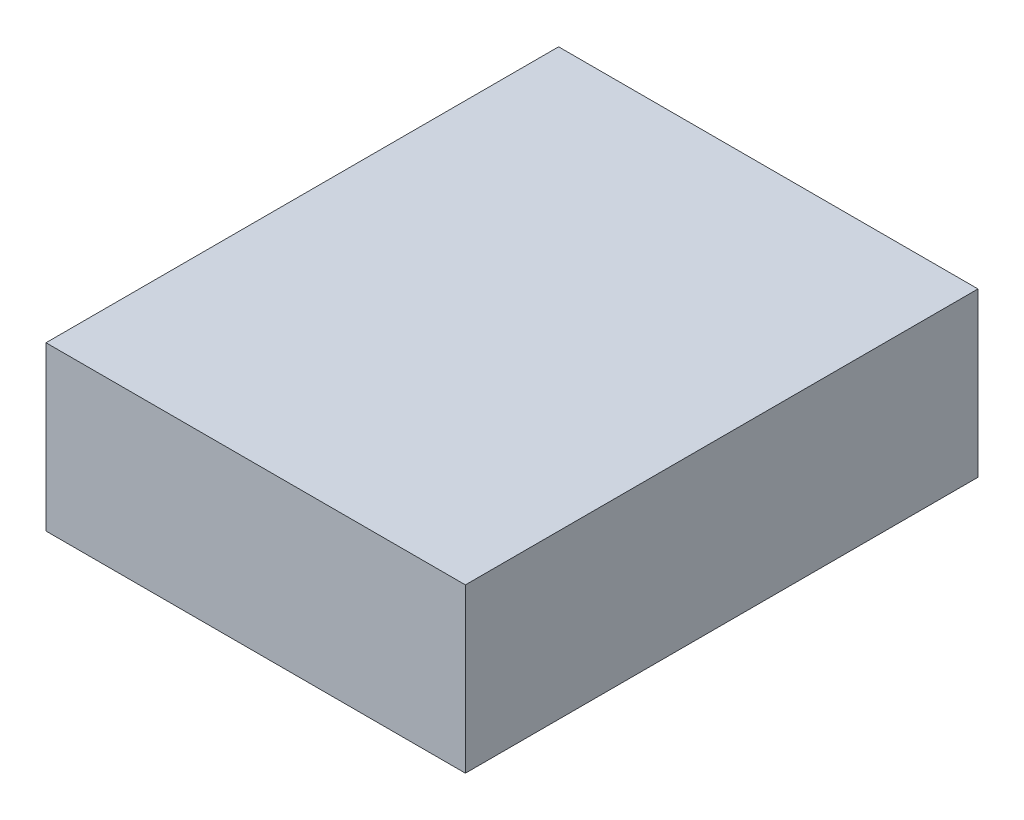
ISO-10303-21;
HEADER;
FILE_DESCRIPTION(('STEP AP214'),'2;1');
FILE_NAME('part.step','',(''),(''),'','','');
FILE_SCHEMA(('AUTOMOTIVE_DESIGN { 1 0 10303 214 1 1 1 1 }'));
ENDSEC;
DATA;
#1=APPLICATION_CONTEXT('core data for automotive mechanical design processes');
#2=APPLICATION_PROTOCOL_DEFINITION('international standard','automotive_design',2000,#1);
#3=PRODUCT_CONTEXT('',#1,'mechanical');
#4=PRODUCT('Part','Part','',(#3));
#5=PRODUCT_RELATED_PRODUCT_CATEGORY('part','',(#4));
#6=PRODUCT_DEFINITION_FORMATION('','',#4);
#7=PRODUCT_DEFINITION_CONTEXT('part definition',#1,'design');
#8=PRODUCT_DEFINITION('design','',#6,#7);
#9=PRODUCT_DEFINITION_SHAPE('','',#8);
#10=(LENGTH_UNIT() NAMED_UNIT(*) SI_UNIT(.MILLI.,.METRE.));
#11=(NAMED_UNIT(*) PLANE_ANGLE_UNIT() SI_UNIT($,.RADIAN.));
#12=(NAMED_UNIT(*) SI_UNIT($,.STERADIAN.) SOLID_ANGLE_UNIT());
#13=UNCERTAINTY_MEASURE_WITH_UNIT(LENGTH_MEASURE(1.E-05),#10,'distance_accuracy_value','');
#14=(GEOMETRIC_REPRESENTATION_CONTEXT(3) GLOBAL_UNCERTAINTY_ASSIGNED_CONTEXT((#13)) GLOBAL_UNIT_ASSIGNED_CONTEXT((#10,
#11,#12)) REPRESENTATION_CONTEXT('',''));
#15=CARTESIAN_POINT('',(0.,0.,0.));
#16=DIRECTION('',(0.,0.,1.));
#17=DIRECTION('',(1.,0.,0.));
#18=AXIS2_PLACEMENT_3D('',#15,#16,#17);
#19=CARTESIAN_POINT('',(4.50000116,-1.75000158,0.));
#20=DIRECTION('',(0.,-1.,0.));
#21=DIRECTION('',(0.,0.,-1.));
#22=AXIS2_PLACEMENT_3D('',#19,#20,#21);
#23=PLANE('',#22);
#24=DIRECTION('',(0.,0.,1.));
#25=VECTOR('',#24,1.);
#26=CARTESIAN_POINT('',(-4.50000116,-1.75000158,0.));
#27=LINE('',#26,#25);
#28=CARTESIAN_POINT('',(-4.50000116,-1.75000158,0.));
#29=VERTEX_POINT('',#28);
#30=CARTESIAN_POINT('',(-4.50000116,-1.75000158,11.));
#31=VERTEX_POINT('',#30);
#32=EDGE_CURVE('E20',#29,#31,#27,.T.);
#33=ORIENTED_EDGE('',*,*,#32,.F.);
#34=DIRECTION('',(1.,0.,0.));
#35=VECTOR('',#34,1.);
#36=CARTESIAN_POINT('',(-4.50000116,-1.75000158,0.));
#37=LINE('',#36,#35);
#38=CARTESIAN_POINT('',(4.50000116,-1.75000158,0.));
#39=VERTEX_POINT('',#38);
#40=EDGE_CURVE('E80',#29,#39,#37,.T.);
#41=ORIENTED_EDGE('',*,*,#40,.T.);
#42=DIRECTION('',(0.,0.,-1.));
#43=VECTOR('',#42,1.);
#44=CARTESIAN_POINT('',(4.50000116,-1.75000158,0.));
#45=LINE('',#44,#43);
#46=CARTESIAN_POINT('',(4.50000116,-1.75000158,11.));
#47=VERTEX_POINT('',#46);
#48=EDGE_CURVE('E68',#47,#39,#45,.T.);
#49=ORIENTED_EDGE('',*,*,#48,.F.);
#50=DIRECTION('',(1.,0.,0.));
#51=VECTOR('',#50,1.);
#52=CARTESIAN_POINT('',(-4.50000116,-1.75000158,11.));
#53=LINE('',#52,#51);
#54=EDGE_CURVE('E56',#31,#47,#53,.T.);
#55=ORIENTED_EDGE('',*,*,#54,.F.);
#56=EDGE_LOOP('',(#33,#41,#49,#55));
#57=FACE_BOUND('',#56,.T.);
#58=ADVANCED_FACE('F17',(#57),#23,.T.);
#59=CARTESIAN_POINT('',(-4.50000116,-1.75000158,0.));
#60=DIRECTION('',(-1.,0.,0.));
#61=DIRECTION('',(0.,0.,1.));
#62=AXIS2_PLACEMENT_3D('',#59,#60,#61);
#63=PLANE('',#62);
#64=DIRECTION('',(0.,0.,1.));
#65=VECTOR('',#64,1.);
#66=CARTESIAN_POINT('',(-4.50000116,1.74999904,0.));
#67=LINE('',#66,#65);
#68=CARTESIAN_POINT('',(-4.50000116,1.74999904,0.));
#69=VERTEX_POINT('',#68);
#70=CARTESIAN_POINT('',(-4.50000116,1.74999904,11.));
#71=VERTEX_POINT('',#70);
#72=EDGE_CURVE('E83',#69,#71,#67,.T.);
#73=ORIENTED_EDGE('',*,*,#72,.F.);
#74=DIRECTION('',(0.,1.,0.));
#75=VECTOR('',#74,1.);
#76=CARTESIAN_POINT('',(-4.50000116,1.74999904,0.));
#77=LINE('',#76,#75);
#78=EDGE_CURVE('E65',#69,#29,#77,.F.);
#79=ORIENTED_EDGE('',*,*,#78,.T.);
#80=ORIENTED_EDGE('',*,*,#32,.T.);
#81=DIRECTION('',(0.,1.,0.));
#82=VECTOR('',#81,1.);
#83=CARTESIAN_POINT('',(-4.50000116,1.74999904,11.));
#84=LINE('',#83,#82);
#85=EDGE_CURVE('E62',#71,#31,#84,.F.);
#86=ORIENTED_EDGE('',*,*,#85,.F.);
#87=EDGE_LOOP('',(#73,#79,#80,#86));
#88=FACE_BOUND('',#87,.T.);
#89=ADVANCED_FACE('F61',(#88),#63,.T.);
#90=CARTESIAN_POINT('',(-4.50000116,1.74999904,11.));
#91=DIRECTION('',(0.,0.,1.));
#92=DIRECTION('',(1.,0.,0.));
#93=AXIS2_PLACEMENT_3D('',#90,#91,#92);
#94=PLANE('',#93);
#95=DIRECTION('',(0.,1.,0.));
#96=VECTOR('',#95,1.);
#97=CARTESIAN_POINT('',(4.50000116,1.74999904,11.));
#98=LINE('',#97,#96);
#99=CARTESIAN_POINT('',(4.50000116,1.74999904,11.));
#100=VERTEX_POINT('',#99);
#101=EDGE_CURVE('E70',#100,#47,#98,.F.);
#102=ORIENTED_EDGE('',*,*,#101,.F.);
#103=DIRECTION('',(1.,0.,0.));
#104=VECTOR('',#103,1.);
#105=CARTESIAN_POINT('',(-4.50000116,1.74999904,11.));
#106=LINE('',#105,#104);
#107=EDGE_CURVE('E74',#71,#100,#106,.T.);
#108=ORIENTED_EDGE('',*,*,#107,.F.);
#109=ORIENTED_EDGE('',*,*,#85,.T.);
#110=ORIENTED_EDGE('',*,*,#54,.T.);
#111=EDGE_LOOP('',(#102,#108,#109,#110));
#112=FACE_BOUND('',#111,.T.);
#113=ADVANCED_FACE('F72',(#112),#94,.T.);
#114=CARTESIAN_POINT('',(4.50000116,1.74999904,0.));
#115=DIRECTION('',(1.,0.,0.));
#116=DIRECTION('',(0.,0.,-1.));
#117=AXIS2_PLACEMENT_3D('',#114,#115,#116);
#118=PLANE('',#117);
#119=ORIENTED_EDGE('',*,*,#48,.T.);
#120=DIRECTION('',(0.,1.,0.));
#121=VECTOR('',#120,1.);
#122=CARTESIAN_POINT('',(4.50000116,1.74999904,0.));
#123=LINE('',#122,#121);
#124=CARTESIAN_POINT('',(4.50000116,1.74999904,0.));
#125=VERTEX_POINT('',#124);
#126=EDGE_CURVE('E35',#39,#125,#123,.T.);
#127=ORIENTED_EDGE('',*,*,#126,.T.);
#128=DIRECTION('',(0.,0.,1.));
#129=VECTOR('',#128,1.);
#130=CARTESIAN_POINT('',(4.50000116,1.74999904,0.));
#131=LINE('',#130,#129);
#132=EDGE_CURVE('E26',#100,#125,#131,.F.);
#133=ORIENTED_EDGE('',*,*,#132,.F.);
#134=ORIENTED_EDGE('',*,*,#101,.T.);
#135=EDGE_LOOP('',(#119,#127,#133,#134));
#136=FACE_BOUND('',#135,.T.);
#137=ADVANCED_FACE('F89',(#136),#118,.T.);
#138=CARTESIAN_POINT('',(-4.50000116,1.74999904,0.));
#139=DIRECTION('',(0.,0.,1.));
#140=DIRECTION('',(1.,0.,0.));
#141=AXIS2_PLACEMENT_3D('',#138,#139,#140);
#142=PLANE('',#141);
#143=ORIENTED_EDGE('',*,*,#126,.F.);
#144=ORIENTED_EDGE('',*,*,#40,.F.);
#145=ORIENTED_EDGE('',*,*,#78,.F.);
#146=DIRECTION('',(1.,0.,0.));
#147=VECTOR('',#146,1.);
#148=CARTESIAN_POINT('',(-4.50000116,1.74999904,0.));
#149=LINE('',#148,#147);
#150=EDGE_CURVE('E11',#125,#69,#149,.F.);
#151=ORIENTED_EDGE('',*,*,#150,.F.);
#152=EDGE_LOOP('',(#143,#144,#145,#151));
#153=FACE_BOUND('',#152,.T.);
#154=ADVANCED_FACE('F91',(#153),#142,.F.);
#155=CARTESIAN_POINT('',(-4.50000116,1.74999904,0.));
#156=DIRECTION('',(0.,1.,0.));
#157=DIRECTION('',(0.,0.,1.));
#158=AXIS2_PLACEMENT_3D('',#155,#156,#157);
#159=PLANE('',#158);
#160=ORIENTED_EDGE('',*,*,#132,.T.);
#161=ORIENTED_EDGE('',*,*,#150,.T.);
#162=ORIENTED_EDGE('',*,*,#72,.T.);
#163=ORIENTED_EDGE('',*,*,#107,.T.);
#164=EDGE_LOOP('',(#160,#161,#162,#163));
#165=FACE_BOUND('',#164,.T.);
#166=ADVANCED_FACE('F88',(#165),#159,.T.);
#167=CLOSED_SHELL('',(#58,#89,#113,#137,#154,#166));
#168=MANIFOLD_SOLID_BREP('B1',#167);
#169=ADVANCED_BREP_SHAPE_REPRESENTATION('',(#18,#168),#14);
#170=SHAPE_DEFINITION_REPRESENTATION(#9,#169);
ENDSEC;
END-ISO-10303-21;
